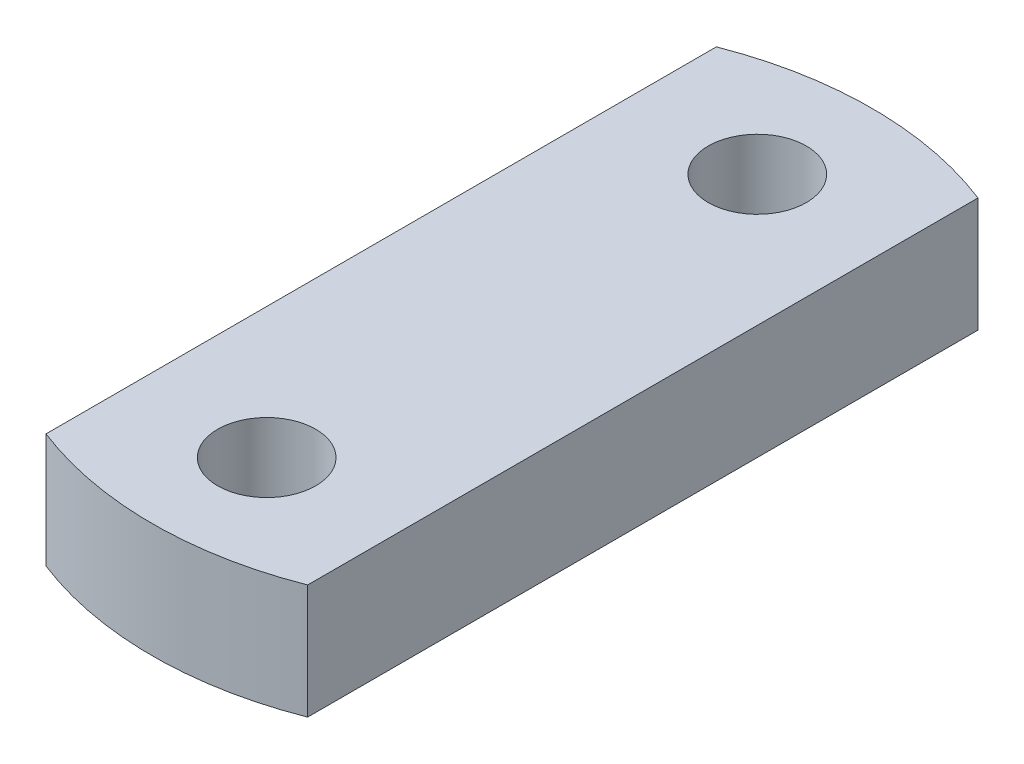
ISO-10303-21;
HEADER;
FILE_DESCRIPTION(('STEP AP214'),'2;1');
FILE_NAME('part.step','',(''),(''),'','','');
FILE_SCHEMA(('AUTOMOTIVE_DESIGN { 1 0 10303 214 1 1 1 1 }'));
ENDSEC;
DATA;
#1=APPLICATION_CONTEXT('core data for automotive mechanical design processes');
#2=APPLICATION_PROTOCOL_DEFINITION('international standard','automotive_design',2000,#1);
#3=PRODUCT_CONTEXT('',#1,'mechanical');
#4=PRODUCT('Part','Part','',(#3));
#5=PRODUCT_RELATED_PRODUCT_CATEGORY('part','',(#4));
#6=PRODUCT_DEFINITION_FORMATION('','',#4);
#7=PRODUCT_DEFINITION_CONTEXT('part definition',#1,'design');
#8=PRODUCT_DEFINITION('design','',#6,#7);
#9=PRODUCT_DEFINITION_SHAPE('','',#8);
#10=(LENGTH_UNIT() NAMED_UNIT(*) SI_UNIT(.MILLI.,.METRE.));
#11=(NAMED_UNIT(*) PLANE_ANGLE_UNIT() SI_UNIT($,.RADIAN.));
#12=(NAMED_UNIT(*) SI_UNIT($,.STERADIAN.) SOLID_ANGLE_UNIT());
#13=UNCERTAINTY_MEASURE_WITH_UNIT(LENGTH_MEASURE(1.E-05),#10,'distance_accuracy_value','');
#14=(GEOMETRIC_REPRESENTATION_CONTEXT(3) GLOBAL_UNCERTAINTY_ASSIGNED_CONTEXT((#13)) GLOBAL_UNIT_ASSIGNED_CONTEXT((#10,
#11,#12)) REPRESENTATION_CONTEXT('',''));
#15=CARTESIAN_POINT('',(0.,0.,0.));
#16=DIRECTION('',(0.,0.,1.));
#17=DIRECTION('',(1.,0.,0.));
#18=AXIS2_PLACEMENT_3D('',#15,#16,#17);
#19=CARTESIAN_POINT('',(0.,35.,0.));
#20=DIRECTION('',(0.,1.,0.));
#21=DIRECTION('',(0.,0.,1.));
#22=AXIS2_PLACEMENT_3D('',#19,#20,#21);
#23=PLANE('',#22);
#24=CARTESIAN_POINT('',(0.,35.,75.));
#25=DIRECTION('',(0.,1.,0.));
#26=DIRECTION('',(0.,0.,1.));
#27=AXIS2_PLACEMENT_3D('',#24,#25,#26);
#28=CIRCLE('',#27,15.);
#29=CARTESIAN_POINT('',(0.,35.,90.));
#30=VERTEX_POINT('',#29);
#31=EDGE_CURVE('E104',#30,#30,#28,.T.);
#32=ORIENTED_EDGE('',*,*,#31,.F.);
#33=EDGE_LOOP('',(#32));
#34=FACE_BOUND('',#33,.T.);
#35=CARTESIAN_POINT('',(0.,35.,0.));
#36=DIRECTION('',(0.,1.,0.));
#37=DIRECTION('',(0.,0.,1.));
#38=AXIS2_PLACEMENT_3D('',#35,#36,#37);
#39=CIRCLE('',#38,110.);
#40=CARTESIAN_POINT('',(40.,35.,-102.469507659596));
#41=VERTEX_POINT('',#40);
#42=CARTESIAN_POINT('',(-40.,35.,-102.469507659596));
#43=VERTEX_POINT('',#42);
#44=EDGE_CURVE('E89',#41,#43,#39,.T.);
#45=ORIENTED_EDGE('',*,*,#44,.T.);
#46=DIRECTION('',(0.,0.,1.));
#47=VECTOR('',#46,1.);
#48=CARTESIAN_POINT('',(-40.,35.,-102.469507659596));
#49=LINE('',#48,#47);
#50=CARTESIAN_POINT('',(-40.,35.,102.469507659596));
#51=VERTEX_POINT('',#50);
#52=EDGE_CURVE('E84',#43,#51,#49,.T.);
#53=ORIENTED_EDGE('',*,*,#52,.T.);
#54=CARTESIAN_POINT('',(0.,35.,0.));
#55=DIRECTION('',(0.,1.,0.));
#56=DIRECTION('',(0.,0.,1.));
#57=AXIS2_PLACEMENT_3D('',#54,#55,#56);
#58=CIRCLE('',#57,110.);
#59=CARTESIAN_POINT('',(40.,35.,102.469507659596));
#60=VERTEX_POINT('',#59);
#61=EDGE_CURVE('E87',#51,#60,#58,.T.);
#62=ORIENTED_EDGE('',*,*,#61,.T.);
#63=DIRECTION('',(0.,0.,-1.));
#64=VECTOR('',#63,1.);
#65=CARTESIAN_POINT('',(40.,35.,-102.469507659596));
#66=LINE('',#65,#64);
#67=EDGE_CURVE('E54',#60,#41,#66,.T.);
#68=ORIENTED_EDGE('',*,*,#67,.T.);
#69=EDGE_LOOP('',(#45,#53,#62,#68));
#70=FACE_BOUND('',#69,.T.);
#71=CARTESIAN_POINT('',(0.,35.,-75.));
#72=DIRECTION('',(0.,1.,0.));
#73=DIRECTION('',(0.,0.,1.));
#74=AXIS2_PLACEMENT_3D('',#71,#72,#73);
#75=CIRCLE('',#74,15.);
#76=CARTESIAN_POINT('',(0.,35.,-60.));
#77=VERTEX_POINT('',#76);
#78=EDGE_CURVE('E119',#77,#77,#75,.T.);
#79=ORIENTED_EDGE('',*,*,#78,.F.);
#80=EDGE_LOOP('',(#79));
#81=FACE_BOUND('',#80,.T.);
#82=ADVANCED_FACE('F37',(#34,#70,#81),#23,.T.);
#83=CARTESIAN_POINT('',(0.,0.,0.));
#84=DIRECTION('',(0.,1.,0.));
#85=DIRECTION('',(0.,0.,1.));
#86=AXIS2_PLACEMENT_3D('',#83,#84,#85);
#87=PLANE('',#86);
#88=CARTESIAN_POINT('',(0.,0.,0.));
#89=DIRECTION('',(0.,1.,0.));
#90=DIRECTION('',(0.,0.,1.));
#91=AXIS2_PLACEMENT_3D('',#88,#89,#90);
#92=CIRCLE('',#91,110.);
#93=CARTESIAN_POINT('',(40.,0.,-102.469507659596));
#94=VERTEX_POINT('',#93);
#95=CARTESIAN_POINT('',(-40.,0.,-102.469507659596));
#96=VERTEX_POINT('',#95);
#97=EDGE_CURVE('E101',#94,#96,#92,.T.);
#98=ORIENTED_EDGE('',*,*,#97,.F.);
#99=DIRECTION('',(0.,0.,-1.));
#100=VECTOR('',#99,1.);
#101=CARTESIAN_POINT('',(40.,0.,-102.469507659596));
#102=LINE('',#101,#100);
#103=CARTESIAN_POINT('',(40.,0.,102.469507659596));
#104=VERTEX_POINT('',#103);
#105=EDGE_CURVE('E77',#104,#94,#102,.T.);
#106=ORIENTED_EDGE('',*,*,#105,.F.);
#107=CARTESIAN_POINT('',(0.,0.,0.));
#108=DIRECTION('',(0.,1.,0.));
#109=DIRECTION('',(0.,0.,1.));
#110=AXIS2_PLACEMENT_3D('',#107,#108,#109);
#111=CIRCLE('',#110,110.);
#112=CARTESIAN_POINT('',(-40.,0.,102.469507659596));
#113=VERTEX_POINT('',#112);
#114=EDGE_CURVE('E71',#113,#104,#111,.T.);
#115=ORIENTED_EDGE('',*,*,#114,.F.);
#116=DIRECTION('',(0.,0.,1.));
#117=VECTOR('',#116,1.);
#118=CARTESIAN_POINT('',(-40.,0.,-102.469507659596));
#119=LINE('',#118,#117);
#120=EDGE_CURVE('E93',#96,#113,#119,.T.);
#121=ORIENTED_EDGE('',*,*,#120,.F.);
#122=EDGE_LOOP('',(#98,#106,#115,#121));
#123=FACE_BOUND('',#122,.T.);
#124=CARTESIAN_POINT('',(0.,0.,75.));
#125=DIRECTION('',(0.,1.,0.));
#126=DIRECTION('',(0.,0.,1.));
#127=AXIS2_PLACEMENT_3D('',#124,#125,#126);
#128=CIRCLE('',#127,15.);
#129=CARTESIAN_POINT('',(0.,0.,90.));
#130=VERTEX_POINT('',#129);
#131=EDGE_CURVE('E116',#130,#130,#128,.T.);
#132=ORIENTED_EDGE('',*,*,#131,.T.);
#133=EDGE_LOOP('',(#132));
#134=FACE_BOUND('',#133,.T.);
#135=CARTESIAN_POINT('',(0.,0.,-75.));
#136=DIRECTION('',(0.,1.,0.));
#137=DIRECTION('',(0.,0.,1.));
#138=AXIS2_PLACEMENT_3D('',#135,#136,#137);
#139=CIRCLE('',#138,15.);
#140=CARTESIAN_POINT('',(0.,0.,-60.));
#141=VERTEX_POINT('',#140);
#142=EDGE_CURVE('E122',#141,#141,#139,.T.);
#143=ORIENTED_EDGE('',*,*,#142,.T.);
#144=EDGE_LOOP('',(#143));
#145=FACE_BOUND('',#144,.T.);
#146=ADVANCED_FACE('F112',(#123,#134,#145),#87,.F.);
#147=CARTESIAN_POINT('',(0.,35.,0.));
#148=DIRECTION('',(0.,-1.,0.));
#149=DIRECTION('',(0.,0.,-1.));
#150=AXIS2_PLACEMENT_3D('',#147,#148,#149);
#151=CYLINDRICAL_SURFACE('',#150,110.);
#152=ORIENTED_EDGE('',*,*,#97,.T.);
#153=DIRECTION('',(0.,-1.,0.));
#154=VECTOR('',#153,1.);
#155=CARTESIAN_POINT('',(-40.,35.,-102.469507659596));
#156=LINE('',#155,#154);
#157=EDGE_CURVE('E11',#43,#96,#156,.T.);
#158=ORIENTED_EDGE('',*,*,#157,.F.);
#159=ORIENTED_EDGE('',*,*,#44,.F.);
#160=DIRECTION('',(0.,-1.,0.));
#161=VECTOR('',#160,1.);
#162=CARTESIAN_POINT('',(40.,35.,-102.469507659596));
#163=LINE('',#162,#161);
#164=EDGE_CURVE('E97',#41,#94,#163,.T.);
#165=ORIENTED_EDGE('',*,*,#164,.T.);
#166=EDGE_LOOP('',(#152,#158,#159,#165));
#167=FACE_BOUND('',#166,.T.);
#168=ADVANCED_FACE('F39',(#167),#151,.T.);
#169=CARTESIAN_POINT('',(-40.,35.,-102.469507659596));
#170=DIRECTION('',(1.,0.,0.));
#171=DIRECTION('',(0.,0.,-1.));
#172=AXIS2_PLACEMENT_3D('',#169,#170,#171);
#173=PLANE('',#172);
#174=ORIENTED_EDGE('',*,*,#120,.T.);
#175=DIRECTION('',(0.,-1.,0.));
#176=VECTOR('',#175,1.);
#177=CARTESIAN_POINT('',(-40.,35.,102.469507659596));
#178=LINE('',#177,#176);
#179=EDGE_CURVE('E46',#51,#113,#178,.T.);
#180=ORIENTED_EDGE('',*,*,#179,.F.);
#181=ORIENTED_EDGE('',*,*,#52,.F.);
#182=ORIENTED_EDGE('',*,*,#157,.T.);
#183=EDGE_LOOP('',(#174,#180,#181,#182));
#184=FACE_BOUND('',#183,.T.);
#185=ADVANCED_FACE('F92',(#184),#173,.F.);
#186=CARTESIAN_POINT('',(0.,35.,0.));
#187=DIRECTION('',(0.,-1.,0.));
#188=DIRECTION('',(0.,0.,-1.));
#189=AXIS2_PLACEMENT_3D('',#186,#187,#188);
#190=CYLINDRICAL_SURFACE('',#189,110.);
#191=ORIENTED_EDGE('',*,*,#114,.T.);
#192=DIRECTION('',(0.,-1.,0.));
#193=VECTOR('',#192,1.);
#194=CARTESIAN_POINT('',(40.,35.,102.469507659596));
#195=LINE('',#194,#193);
#196=EDGE_CURVE('E94',#60,#104,#195,.T.);
#197=ORIENTED_EDGE('',*,*,#196,.F.);
#198=ORIENTED_EDGE('',*,*,#61,.F.);
#199=ORIENTED_EDGE('',*,*,#179,.T.);
#200=EDGE_LOOP('',(#191,#197,#198,#199));
#201=FACE_BOUND('',#200,.T.);
#202=ADVANCED_FACE('F95',(#201),#190,.T.);
#203=CARTESIAN_POINT('',(40.,35.,-102.469507659596));
#204=DIRECTION('',(-1.,0.,0.));
#205=DIRECTION('',(0.,0.,1.));
#206=AXIS2_PLACEMENT_3D('',#203,#204,#205);
#207=PLANE('',#206);
#208=ORIENTED_EDGE('',*,*,#105,.T.);
#209=ORIENTED_EDGE('',*,*,#164,.F.);
#210=ORIENTED_EDGE('',*,*,#67,.F.);
#211=ORIENTED_EDGE('',*,*,#196,.T.);
#212=EDGE_LOOP('',(#208,#209,#210,#211));
#213=FACE_BOUND('',#212,.T.);
#214=ADVANCED_FACE('F109',(#213),#207,.F.);
#215=CARTESIAN_POINT('',(0.,35.,75.));
#216=DIRECTION('',(0.,-1.,0.));
#217=DIRECTION('',(0.,0.,-1.));
#218=AXIS2_PLACEMENT_3D('',#215,#216,#217);
#219=CYLINDRICAL_SURFACE('',#218,15.);
#220=ORIENTED_EDGE('',*,*,#31,.T.);
#221=EDGE_LOOP('',(#220));
#222=FACE_BOUND('',#221,.T.);
#223=ORIENTED_EDGE('',*,*,#131,.F.);
#224=EDGE_LOOP('',(#223));
#225=FACE_BOUND('',#224,.T.);
#226=ADVANCED_FACE('F139',(#222,#225),#219,.F.);
#227=CARTESIAN_POINT('',(0.,35.,-75.));
#228=DIRECTION('',(0.,-1.,0.));
#229=DIRECTION('',(0.,0.,-1.));
#230=AXIS2_PLACEMENT_3D('',#227,#228,#229);
#231=CYLINDRICAL_SURFACE('',#230,15.);
#232=ORIENTED_EDGE('',*,*,#78,.T.);
#233=EDGE_LOOP('',(#232));
#234=FACE_BOUND('',#233,.T.);
#235=ORIENTED_EDGE('',*,*,#142,.F.);
#236=EDGE_LOOP('',(#235));
#237=FACE_BOUND('',#236,.T.);
#238=ADVANCED_FACE('F128',(#234,#237),#231,.F.);
#239=CLOSED_SHELL('',(#82,#146,#168,#185,#202,#214,#226,#238));
#240=MANIFOLD_SOLID_BREP('B2',#239);
#241=ADVANCED_BREP_SHAPE_REPRESENTATION('',(#18,#240),#14);
#242=SHAPE_DEFINITION_REPRESENTATION(#9,#241);
ENDSEC;
END-ISO-10303-21;
